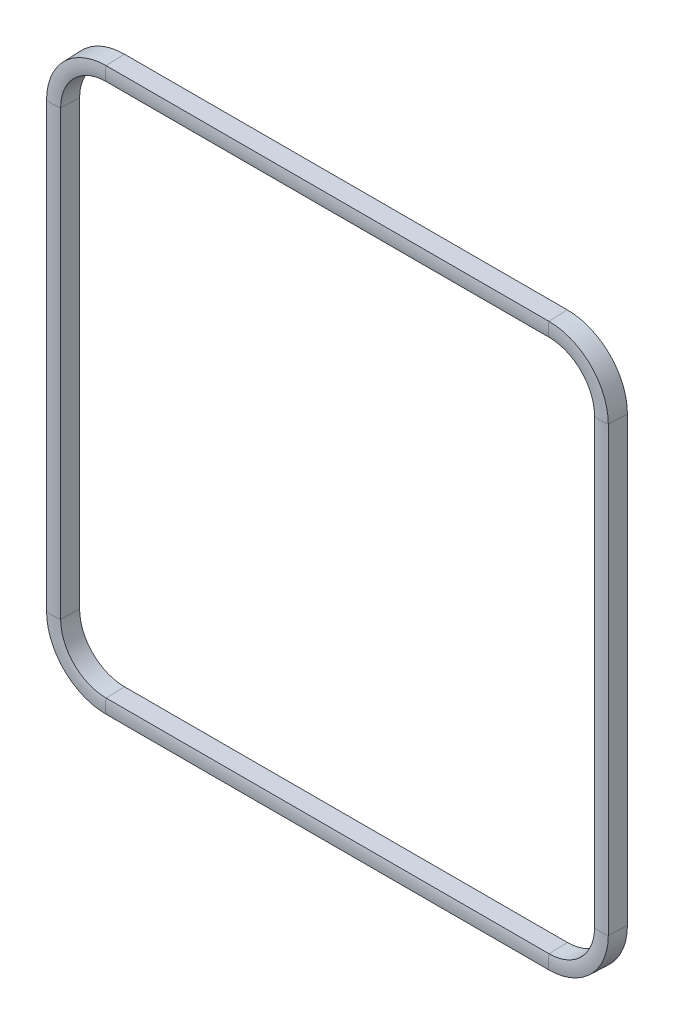
ISO-10303-21;
HEADER;
FILE_DESCRIPTION(('STEP AP214'),'2;1');
FILE_NAME('part.step','',(''),(''),'','','');
FILE_SCHEMA(('AUTOMOTIVE_DESIGN { 1 0 10303 214 1 1 1 1 }'));
ENDSEC;
DATA;
#1=APPLICATION_CONTEXT('core data for automotive mechanical design processes');
#2=APPLICATION_PROTOCOL_DEFINITION('international standard','automotive_design',2000,#1);
#3=PRODUCT_CONTEXT('',#1,'mechanical');
#4=PRODUCT('Part','Part','',(#3));
#5=PRODUCT_RELATED_PRODUCT_CATEGORY('part','',(#4));
#6=PRODUCT_DEFINITION_FORMATION('','',#4);
#7=PRODUCT_DEFINITION_CONTEXT('part definition',#1,'design');
#8=PRODUCT_DEFINITION('design','',#6,#7);
#9=PRODUCT_DEFINITION_SHAPE('','',#8);
#10=(LENGTH_UNIT() NAMED_UNIT(*) SI_UNIT(.MILLI.,.METRE.));
#11=(NAMED_UNIT(*) PLANE_ANGLE_UNIT() SI_UNIT($,.RADIAN.));
#12=(NAMED_UNIT(*) SI_UNIT($,.STERADIAN.) SOLID_ANGLE_UNIT());
#13=UNCERTAINTY_MEASURE_WITH_UNIT(LENGTH_MEASURE(1.E-05),#10,'distance_accuracy_value','');
#14=(GEOMETRIC_REPRESENTATION_CONTEXT(3) GLOBAL_UNCERTAINTY_ASSIGNED_CONTEXT((#13)) GLOBAL_UNIT_ASSIGNED_CONTEXT((#10,
#11,#12)) REPRESENTATION_CONTEXT('',''));
#15=CARTESIAN_POINT('',(0.,0.,0.));
#16=DIRECTION('',(0.,0.,1.));
#17=DIRECTION('',(1.,0.,0.));
#18=AXIS2_PLACEMENT_3D('',#15,#16,#17);
#19=CARTESIAN_POINT('',(1.95906030197852,-66.,32.4003655037885));
#20=CARTESIAN_POINT('',(1.95906030197851,-8.,32.4003655037885));
#21=CARTESIAN_POINT('',(2.76408131139616,-66.,32.5898763520899));
#22=CARTESIAN_POINT('',(2.76408131139614,-8.,32.5898763520899));
#23=CARTESIAN_POINT('',(3.78024547415872,-66.,32.4202454741587));
#24=CARTESIAN_POINT('',(3.78024547415871,-8.,32.4202454741587));
#25=B_SPLINE_SURFACE_WITH_KNOTS('',2,1,((#19,#20),(#21,#22),(#23,#24)),.UNSPECIFIED.,.F.,.F.,
.F.,(3,3),(2,2),(0.,1.),(0.,1.),.UNSPECIFIED.);
#26=DIRECTION('',(0.,1.,0.));
#27=VECTOR('',#26,1.);
#28=CARTESIAN_POINT('',(1.95906030197852,-66.,32.4003655037885));
#29=LINE('',#28,#27);
#30=CARTESIAN_POINT('',(1.95906030197925,-66.,32.4003655037924));
#31=VERTEX_POINT('',#30);
#32=CARTESIAN_POINT('',(1.9590603019782,-8.,32.4003655037963));
#33=VERTEX_POINT('',#32);
#34=EDGE_CURVE('E137',#31,#33,#29,.T.);
#35=CARTESIAN_POINT('',(1.95906030197852,-66.,32.4003655037885));
#36=CARTESIAN_POINT('',(2.76408131139616,-66.,32.5898763520899));
#37=CARTESIAN_POINT('',(3.78024547415872,-66.,32.4202454741587));
#38=B_SPLINE_CURVE_WITH_KNOTS('',2,(#35,#36,#37),.UNSPECIFIED.,.F.,.F.,(3,3),(0.,1.),.UNSPECIFIED.);
#39=CARTESIAN_POINT('',(3.78024547415872,-66.,32.4202454741587));
#40=VERTEX_POINT('',#39);
#41=EDGE_CURVE('E135',#31,#40,#38,.T.);
#42=DIRECTION('',(0.,1.,0.));
#43=VECTOR('',#42,1.);
#44=CARTESIAN_POINT('',(3.78024547415872,-66.,32.4202454741587));
#45=LINE('',#44,#43);
#46=CARTESIAN_POINT('',(3.7802454741587,-8.,32.4202454741587));
#47=VERTEX_POINT('',#46);
#48=EDGE_CURVE('E94',#47,#40,#45,.F.);
#49=CARTESIAN_POINT('',(1.95906030197851,-8.,32.4003655037885));
#50=CARTESIAN_POINT('',(2.76408131139613,-8.,32.5898763520899));
#51=CARTESIAN_POINT('',(3.7802454741587,-8.,32.4202454741587));
#52=B_SPLINE_CURVE_WITH_KNOTS('',2,(#49,#50,#51),.UNSPECIFIED.,.F.,.F.,(3,3),(0.,1.),.UNSPECIFIED.);
#53=EDGE_CURVE('E218',#47,#33,#52,.F.);
#54=ORIENTED_EDGE('',*,*,#34,.F.);
#55=ORIENTED_EDGE('',*,*,#41,.T.);
#56=ORIENTED_EDGE('',*,*,#48,.F.);
#57=ORIENTED_EDGE('',*,*,#53,.T.);
#58=EDGE_LOOP('',(#54,#55,#56,#57));
#59=FACE_BOUND('',#58,.T.);
#60=ADVANCED_FACE('F15',(#59),#25,.T.);
#61=CARTESIAN_POINT('',(1.95906030197852,-66.,32.4003655037885));
#62=CARTESIAN_POINT('',(1.95906030197852,-69.4907367058999,32.4003655037885));
#63=CARTESIAN_POINT('',(-0.509263294100096,-71.9590603019785,32.4003655037885));
#64=CARTESIAN_POINT('',(-3.99999999999999,-71.9590603019785,32.4003655037885));
#65=CARTESIAN_POINT('',(2.76408131139616,-66.,32.5898763520899));
#66=CARTESIAN_POINT('',(2.76408131139616,-69.9623070952215,32.5898763520899));
#67=CARTESIAN_POINT('',(-0.0376929047785236,-72.7640813113961,32.5898763520899));
#68=CARTESIAN_POINT('',(-3.99999999999999,-72.7640813113961,32.5898763520899));
#69=CARTESIAN_POINT('',(3.78024547415872,-66.,32.4202454741587));
#70=CARTESIAN_POINT('',(3.78024547415872,-70.5575622801703,32.4202454741587));
#71=CARTESIAN_POINT('',(0.557562280170287,-73.7802454741587,32.4202454741587));
#72=CARTESIAN_POINT('',(-3.99999999999999,-73.7802454741587,32.4202454741587));
#73=(BOUNDED_SURFACE() B_SPLINE_SURFACE(2,3,((#61,#62,#63,#64),(#65,#66,#67,#68),(#69,#70,#71,
#72)),.UNSPECIFIED.,.F.,.F.,.F.) B_SPLINE_SURFACE_WITH_KNOTS((3,3),(4,4),(0.,1.),(0.,1.),
.UNSPECIFIED.) GEOMETRIC_REPRESENTATION_ITEM() RATIONAL_B_SPLINE_SURFACE(((1.,0.804737854124365,
0.804737854124365,1.),(1.,0.804737854124365,0.804737854124365,1.),(1.,0.804737854124365,
0.804737854124365,1.))) REPRESENTATION_ITEM('') SURFACE());
#74=CARTESIAN_POINT('',(-3.99999999999999,-66.,32.4003655038041));
#75=DIRECTION('',(0.,0.,1.));
#76=DIRECTION('',(1.,0.,0.));
#77=AXIS2_PLACEMENT_3D('',#74,#75,#76);
#78=CIRCLE('',#77,5.95906030198144);
#79=CARTESIAN_POINT('',(-3.99999999999999,-71.9590603019792,32.4003655037924));
#80=VERTEX_POINT('',#79);
#81=EDGE_CURVE('E230',#31,#80,#78,.F.);
#82=CARTESIAN_POINT('',(-3.99999999999999,-71.9590603019785,32.4003655037885));
#83=CARTESIAN_POINT('',(-3.99999999999999,-72.7640813113961,32.5898763520899));
#84=CARTESIAN_POINT('',(-3.99999999999999,-73.7802454741587,32.4202454741587));
#85=B_SPLINE_CURVE_WITH_KNOTS('',2,(#82,#83,#84),.UNSPECIFIED.,.F.,.F.,(3,3),(0.,1.),.UNSPECIFIED.);
#86=CARTESIAN_POINT('',(-3.99999999999999,-73.7802454741587,32.4202454741587));
#87=VERTEX_POINT('',#86);
#88=EDGE_CURVE('E141',#80,#87,#85,.T.);
#89=CARTESIAN_POINT('',(-3.99999999999999,-66.,32.4202454741587));
#90=DIRECTION('',(0.,0.,-1.));
#91=DIRECTION('',(-1.,0.,0.));
#92=AXIS2_PLACEMENT_3D('',#89,#90,#91);
#93=CIRCLE('',#92,7.78024547415871);
#94=EDGE_CURVE('E155',#40,#87,#93,.T.);
#95=ORIENTED_EDGE('',*,*,#81,.T.);
#96=ORIENTED_EDGE('',*,*,#88,.T.);
#97=ORIENTED_EDGE('',*,*,#94,.F.);
#98=ORIENTED_EDGE('',*,*,#41,.F.);
#99=EDGE_LOOP('',(#95,#96,#97,#98));
#100=FACE_BOUND('',#99,.T.);
#101=ADVANCED_FACE('F156',(#100),#73,.F.);
#102=CARTESIAN_POINT('',(-3.99999999999999,-71.9590603019785,32.4003655037885));
#103=CARTESIAN_POINT('',(-62.,-71.9590603019785,32.4003655037885));
#104=CARTESIAN_POINT('',(-3.99999999999999,-72.7640813113961,32.5898763520899));
#105=CARTESIAN_POINT('',(-62.,-72.7640813113961,32.5898763520899));
#106=CARTESIAN_POINT('',(-3.99999999999999,-73.7802454741587,32.4202454741587));
#107=CARTESIAN_POINT('',(-62.,-73.7802454741587,32.4202454741587));
#108=B_SPLINE_SURFACE_WITH_KNOTS('',2,1,((#102,#103),(#104,#105),(#106,#107)),.UNSPECIFIED.,.F.,
.F.,.F.,(3,3),(2,2),(0.,1.),(0.,1.),.UNSPECIFIED.);
#109=DIRECTION('',(1.,0.,0.));
#110=VECTOR('',#109,1.);
#111=CARTESIAN_POINT('',(-3.99999999999999,-71.9590603019785,32.4003655037885));
#112=LINE('',#111,#110);
#113=CARTESIAN_POINT('',(-62.,-71.9590603019793,32.4003655037924));
#114=VERTEX_POINT('',#113);
#115=EDGE_CURVE('E176',#80,#114,#112,.F.);
#116=CARTESIAN_POINT('',(-62.,-71.9590603019785,32.4003655037885));
#117=CARTESIAN_POINT('',(-62.,-72.7640813113961,32.5898763520899));
#118=CARTESIAN_POINT('',(-62.,-73.7802454741587,32.4202454741587));
#119=B_SPLINE_CURVE_WITH_KNOTS('',2,(#116,#117,#118),.UNSPECIFIED.,.F.,.F.,(3,3),(0.,1.),.UNSPECIFIED.);
#120=CARTESIAN_POINT('',(-62.,-73.7802454741587,32.4202454741587));
#121=VERTEX_POINT('',#120);
#122=EDGE_CURVE('E281',#114,#121,#119,.T.);
#123=DIRECTION('',(1.,0.,0.));
#124=VECTOR('',#123,1.);
#125=CARTESIAN_POINT('',(-3.99999999999999,-73.7802454741587,32.4202454741587));
#126=LINE('',#125,#124);
#127=EDGE_CURVE('E161',#121,#87,#126,.T.);
#128=ORIENTED_EDGE('',*,*,#115,.T.);
#129=ORIENTED_EDGE('',*,*,#122,.T.);
#130=ORIENTED_EDGE('',*,*,#127,.T.);
#131=ORIENTED_EDGE('',*,*,#88,.F.);
#132=EDGE_LOOP('',(#128,#129,#130,#131));
#133=FACE_BOUND('',#132,.T.);
#134=ADVANCED_FACE('F454',(#133),#108,.F.);
#135=CARTESIAN_POINT('',(-62.,-71.9590603019785,32.4003655037885));
#136=CARTESIAN_POINT('',(-65.4907367058999,-71.9590603019785,32.4003655037885));
#137=CARTESIAN_POINT('',(-67.9590603019785,-69.4907367058999,32.4003655037885));
#138=CARTESIAN_POINT('',(-67.9590603019785,-66.,32.4003655037885));
#139=CARTESIAN_POINT('',(-62.,-72.7640813113961,32.5898763520899));
#140=CARTESIAN_POINT('',(-65.9623070952214,-72.7640813113961,32.5898763520899));
#141=CARTESIAN_POINT('',(-68.7640813113961,-69.9623070952215,32.5898763520899));
#142=CARTESIAN_POINT('',(-68.7640813113961,-66.,32.5898763520899));
#143=CARTESIAN_POINT('',(-62.,-73.7802454741587,32.4202454741587));
#144=CARTESIAN_POINT('',(-66.5575622801703,-73.7802454741587,32.4202454741587));
#145=CARTESIAN_POINT('',(-69.7802454741587,-70.5575622801703,32.4202454741587));
#146=CARTESIAN_POINT('',(-69.7802454741587,-66.,32.4202454741587));
#147=(BOUNDED_SURFACE() B_SPLINE_SURFACE(2,3,((#135,#136,#137,#138),(#139,#140,#141,#142),(#143,
#144,#145,#146)),.UNSPECIFIED.,.F.,.F.,.F.) B_SPLINE_SURFACE_WITH_KNOTS((3,3),(4,4),(0.,1.),(0.,
1.),.UNSPECIFIED.) GEOMETRIC_REPRESENTATION_ITEM() RATIONAL_B_SPLINE_SURFACE(((1.,
0.804737854124365,0.804737854124365,1.),(1.,0.804737854124365,0.804737854124365,1.),(1.,
0.804737854124365,0.804737854124365,1.))) REPRESENTATION_ITEM('') SURFACE());
#148=CARTESIAN_POINT('',(-62.,-66.,32.4003655038041));
#149=DIRECTION('',(0.,0.,1.));
#150=DIRECTION('',(1.,0.,0.));
#151=AXIS2_PLACEMENT_3D('',#148,#149,#150);
#152=CIRCLE('',#151,5.95906030198161);
#153=CARTESIAN_POINT('',(-67.9590603019789,-66.,32.4003655037679));
#154=VERTEX_POINT('',#153);
#155=EDGE_CURVE('E184',#114,#154,#152,.F.);
#156=CARTESIAN_POINT('',(-67.9590603019785,-66.,32.4003655037885));
#157=CARTESIAN_POINT('',(-68.7640813113961,-66.,32.5898763520899));
#158=CARTESIAN_POINT('',(-69.7802454741587,-66.,32.4202454741587));
#159=B_SPLINE_CURVE_WITH_KNOTS('',2,(#156,#157,#158),.UNSPECIFIED.,.F.,.F.,(3,3),(0.,1.),.UNSPECIFIED.);
#160=CARTESIAN_POINT('',(-69.7802454741587,-66.,32.4202454741587));
#161=VERTEX_POINT('',#160);
#162=EDGE_CURVE('E260',#154,#161,#159,.T.);
#163=CARTESIAN_POINT('',(-62.,-66.,32.4202454741587));
#164=DIRECTION('',(0.,0.,-1.));
#165=DIRECTION('',(-1.,0.,0.));
#166=AXIS2_PLACEMENT_3D('',#163,#164,#165);
#167=CIRCLE('',#166,7.7802454741587);
#168=EDGE_CURVE('E272',#121,#161,#167,.T.);
#169=ORIENTED_EDGE('',*,*,#155,.T.);
#170=ORIENTED_EDGE('',*,*,#162,.T.);
#171=ORIENTED_EDGE('',*,*,#168,.F.);
#172=ORIENTED_EDGE('',*,*,#122,.F.);
#173=EDGE_LOOP('',(#169,#170,#171,#172));
#174=FACE_BOUND('',#173,.T.);
#175=ADVANCED_FACE('F452',(#174),#147,.F.);
#176=CARTESIAN_POINT('',(-67.9590603019785,-66.,32.4003655037885));
#177=CARTESIAN_POINT('',(-67.9590603019785,-8.00000000000003,32.4003655037885));
#178=CARTESIAN_POINT('',(-68.7640813113961,-66.,32.5898763520899));
#179=CARTESIAN_POINT('',(-68.7640813113961,-8.00000000000003,32.5898763520899));
#180=CARTESIAN_POINT('',(-69.7802454741587,-66.,32.4202454741587));
#181=CARTESIAN_POINT('',(-69.7802454741587,-8.00000000000003,32.4202454741587));
#182=B_SPLINE_SURFACE_WITH_KNOTS('',2,1,((#176,#177),(#178,#179),(#180,#181)),.UNSPECIFIED.,.F.,
.F.,.F.,(3,3),(2,2),(0.,1.),(0.,1.),.UNSPECIFIED.);
#183=DIRECTION('',(0.,1.,0.));
#184=VECTOR('',#183,1.);
#185=CARTESIAN_POINT('',(-67.9590603019785,-66.,32.4003655037885));
#186=LINE('',#185,#184);
#187=CARTESIAN_POINT('',(-67.9590603019784,-8.,32.4003655037924));
#188=VERTEX_POINT('',#187);
#189=EDGE_CURVE('E189',#154,#188,#186,.T.);
#190=CARTESIAN_POINT('',(-67.9590603019785,-8.,32.4003655037885));
#191=CARTESIAN_POINT('',(-68.7640813113961,-8.,32.5898763520899));
#192=CARTESIAN_POINT('',(-69.7802454741587,-8.,32.4202454741587));
#193=B_SPLINE_CURVE_WITH_KNOTS('',2,(#190,#191,#192),.UNSPECIFIED.,.F.,.F.,(3,3),(0.,1.),.UNSPECIFIED.);
#194=CARTESIAN_POINT('',(-69.7802454741587,-8.,32.4202454741587));
#195=VERTEX_POINT('',#194);
#196=EDGE_CURVE('E251',#188,#195,#193,.T.);
#197=DIRECTION('',(0.,1.,0.));
#198=VECTOR('',#197,1.);
#199=CARTESIAN_POINT('',(-69.7802454741587,-66.,32.4202454741587));
#200=LINE('',#199,#198);
#201=EDGE_CURVE('E265',#195,#161,#200,.F.);
#202=ORIENTED_EDGE('',*,*,#189,.T.);
#203=ORIENTED_EDGE('',*,*,#196,.T.);
#204=ORIENTED_EDGE('',*,*,#201,.T.);
#205=ORIENTED_EDGE('',*,*,#162,.F.);
#206=EDGE_LOOP('',(#202,#203,#204,#205));
#207=FACE_BOUND('',#206,.T.);
#208=ADVANCED_FACE('F449',(#207),#182,.F.);
#209=CARTESIAN_POINT('',(-67.9590603019785,-8.,32.4003655037885));
#210=CARTESIAN_POINT('',(-67.9590603019785,-4.50926329410011,32.4003655037885));
#211=CARTESIAN_POINT('',(-65.4907367058999,-2.04093969802149,32.4003655037885));
#212=CARTESIAN_POINT('',(-62.,-2.04093969802149,32.4003655037885));
#213=CARTESIAN_POINT('',(-68.7640813113961,-8.,32.5898763520899));
#214=CARTESIAN_POINT('',(-68.7640813113961,-4.03769290477854,32.5898763520899));
#215=CARTESIAN_POINT('',(-65.9623070952214,-1.23591868860387,32.5898763520899));
#216=CARTESIAN_POINT('',(-62.,-1.23591868860387,32.5898763520899));
#217=CARTESIAN_POINT('',(-69.7802454741587,-8.,32.4202454741587));
#218=CARTESIAN_POINT('',(-69.7802454741587,-3.44243771982973,32.4202454741587));
#219=CARTESIAN_POINT('',(-66.5575622801703,-0.219754525841304,32.4202454741587));
#220=CARTESIAN_POINT('',(-62.,-0.219754525841304,32.4202454741587));
#221=(BOUNDED_SURFACE() B_SPLINE_SURFACE(2,3,((#209,#210,#211,#212),(#213,#214,#215,#216),(#217,
#218,#219,#220)),.UNSPECIFIED.,.F.,.F.,.F.) B_SPLINE_SURFACE_WITH_KNOTS((3,3),(4,4),(0.,1.),(0.,
1.),.UNSPECIFIED.) GEOMETRIC_REPRESENTATION_ITEM() RATIONAL_B_SPLINE_SURFACE(((1.,
0.804737854124365,0.804737854124365,1.),(1.,0.804737854124365,0.804737854124365,1.),(1.,
0.804737854124365,0.804737854124365,1.))) REPRESENTATION_ITEM('') SURFACE());
#222=CARTESIAN_POINT('',(-62.,-8.,32.4003655038041));
#223=DIRECTION('',(0.,0.,1.));
#224=DIRECTION('',(1.,0.,0.));
#225=AXIS2_PLACEMENT_3D('',#222,#223,#224);
#226=CIRCLE('',#225,5.95906030197806);
#227=CARTESIAN_POINT('',(-62.,-2.0409396980221,32.4003655037963));
#228=VERTEX_POINT('',#227);
#229=EDGE_CURVE('E194',#188,#228,#226,.F.);
#230=CARTESIAN_POINT('',(-62.,-2.04093969802149,32.4003655037885));
#231=CARTESIAN_POINT('',(-62.,-1.23591868860387,32.5898763520899));
#232=CARTESIAN_POINT('',(-62.,-0.219754525841304,32.4202454741587));
#233=B_SPLINE_CURVE_WITH_KNOTS('',2,(#230,#231,#232),.UNSPECIFIED.,.F.,.F.,(3,3),(0.,1.),.UNSPECIFIED.);
#234=CARTESIAN_POINT('',(-62.,-0.219754525841306,32.4202454741587));
#235=VERTEX_POINT('',#234);
#236=EDGE_CURVE('E221',#228,#235,#233,.T.);
#237=CARTESIAN_POINT('',(-62.,-8.,32.4202454741587));
#238=DIRECTION('',(0.,0.,-1.));
#239=DIRECTION('',(-1.,0.,0.));
#240=AXIS2_PLACEMENT_3D('',#237,#238,#239);
#241=CIRCLE('',#240,7.78024547415869);
#242=EDGE_CURVE('E242',#195,#235,#241,.T.);
#243=ORIENTED_EDGE('',*,*,#229,.T.);
#244=ORIENTED_EDGE('',*,*,#236,.T.);
#245=ORIENTED_EDGE('',*,*,#242,.F.);
#246=ORIENTED_EDGE('',*,*,#196,.F.);
#247=EDGE_LOOP('',(#243,#244,#245,#246));
#248=FACE_BOUND('',#247,.T.);
#249=ADVANCED_FACE('F445',(#248),#221,.F.);
#250=CARTESIAN_POINT('',(-62.,-2.04093969802149,32.4003655037885));
#251=CARTESIAN_POINT('',(-4.,-2.04093969802149,32.4003655037885));
#252=CARTESIAN_POINT('',(-62.,-1.23591868860387,32.5898763520899));
#253=CARTESIAN_POINT('',(-4.,-1.23591868860387,32.5898763520899));
#254=CARTESIAN_POINT('',(-62.,-0.219754525841304,32.4202454741587));
#255=CARTESIAN_POINT('',(-4.,-0.219754525841304,32.4202454741587));
#256=B_SPLINE_SURFACE_WITH_KNOTS('',2,1,((#250,#251),(#252,#253),(#254,#255)),.UNSPECIFIED.,.F.,
.F.,.F.,(3,3),(2,2),(0.,1.),(0.,1.),.UNSPECIFIED.);
#257=DIRECTION('',(1.,0.,0.));
#258=VECTOR('',#257,1.);
#259=CARTESIAN_POINT('',(-62.,-2.04093969802151,32.4003655037885));
#260=LINE('',#259,#258);
#261=CARTESIAN_POINT('',(-4.,-2.04093969802165,32.4003655037924));
#262=VERTEX_POINT('',#261);
#263=EDGE_CURVE('E199',#228,#262,#260,.T.);
#264=CARTESIAN_POINT('',(-4.,-2.04093969802149,32.4003655037885));
#265=CARTESIAN_POINT('',(-4.,-1.23591868860387,32.5898763520899));
#266=CARTESIAN_POINT('',(-4.,-0.219754525841304,32.4202454741587));
#267=B_SPLINE_CURVE_WITH_KNOTS('',2,(#264,#265,#266),.UNSPECIFIED.,.F.,.F.,(3,3),(0.,1.),.UNSPECIFIED.);
#268=CARTESIAN_POINT('',(-4.,-0.219754525841302,32.4202454741587));
#269=VERTEX_POINT('',#268);
#270=EDGE_CURVE('E220',#262,#269,#267,.T.);
#271=DIRECTION('',(1.,0.,0.));
#272=VECTOR('',#271,1.);
#273=CARTESIAN_POINT('',(-62.,-0.219754525841304,32.4202454741587));
#274=LINE('',#273,#272);
#275=EDGE_CURVE('E235',#269,#235,#274,.F.);
#276=ORIENTED_EDGE('',*,*,#263,.T.);
#277=ORIENTED_EDGE('',*,*,#270,.T.);
#278=ORIENTED_EDGE('',*,*,#275,.T.);
#279=ORIENTED_EDGE('',*,*,#236,.F.);
#280=EDGE_LOOP('',(#276,#277,#278,#279));
#281=FACE_BOUND('',#280,.T.);
#282=ADVANCED_FACE('F17',(#281),#256,.F.);
#283=CARTESIAN_POINT('',(-4.,-2.04093969802149,32.4003655037885));
#284=CARTESIAN_POINT('',(-0.509263294100105,-2.04093969802149,32.4003655037885));
#285=CARTESIAN_POINT('',(1.9590603019785,-4.5092632941001,32.4003655037885));
#286=CARTESIAN_POINT('',(1.95906030197851,-8.,32.4003655037885));
#287=CARTESIAN_POINT('',(-4.,-1.23591868860387,32.5898763520899));
#288=CARTESIAN_POINT('',(-0.0376929047785409,-1.23591868860387,32.5898763520899));
#289=CARTESIAN_POINT('',(2.76408131139613,-4.03769290477853,32.5898763520899));
#290=CARTESIAN_POINT('',(2.76408131139613,-8.,32.5898763520899));
#291=CARTESIAN_POINT('',(-4.,-0.219754525841304,32.4202454741587));
#292=CARTESIAN_POINT('',(0.55756228017027,-0.219754525841303,32.4202454741587));
#293=CARTESIAN_POINT('',(3.78024547415869,-3.44243771982972,32.4202454741587));
#294=CARTESIAN_POINT('',(3.7802454741587,-8.,32.4202454741587));
#295=(BOUNDED_SURFACE() B_SPLINE_SURFACE(2,3,((#283,#284,#285,#286),(#287,#288,#289,#290),(#291,
#292,#293,#294)),.UNSPECIFIED.,.F.,.F.,.F.) B_SPLINE_SURFACE_WITH_KNOTS((3,3),(4,4),(0.,1.),(0.,
1.),.UNSPECIFIED.) GEOMETRIC_REPRESENTATION_ITEM() RATIONAL_B_SPLINE_SURFACE(((1.,
0.804737854124365,0.804737854124365,1.),(1.,0.804737854124365,0.804737854124365,1.),(1.,
0.804737854124365,0.804737854124365,1.))) REPRESENTATION_ITEM('') SURFACE());
#296=CARTESIAN_POINT('',(-4.,-8.,32.4003655038041));
#297=DIRECTION('',(0.,0.,1.));
#298=DIRECTION('',(1.,0.,0.));
#299=AXIS2_PLACEMENT_3D('',#296,#297,#298);
#300=CIRCLE('',#299,5.9590603019779);
#301=EDGE_CURVE('E204',#262,#33,#300,.F.);
#302=CARTESIAN_POINT('',(-4.,-8.,32.4202454741587));
#303=DIRECTION('',(0.,0.,-1.));
#304=DIRECTION('',(-1.,0.,0.));
#305=AXIS2_PLACEMENT_3D('',#302,#303,#304);
#306=CIRCLE('',#305,7.7802454741587);
#307=EDGE_CURVE('E214',#269,#47,#306,.T.);
#308=ORIENTED_EDGE('',*,*,#301,.T.);
#309=ORIENTED_EDGE('',*,*,#53,.F.);
#310=ORIENTED_EDGE('',*,*,#307,.F.);
#311=ORIENTED_EDGE('',*,*,#270,.F.);
#312=EDGE_LOOP('',(#308,#309,#310,#311));
#313=FACE_BOUND('',#312,.T.);
#314=ADVANCED_FACE('F513',(#313),#295,.F.);
#315=CARTESIAN_POINT('',(-3.99999999999999,-66.,32.4003655036904));
#316=DIRECTION('',(0.,0.,1.));
#317=DIRECTION('',(1.,0.,0.));
#318=AXIS2_PLACEMENT_3D('',#315,#316,#317);
#319=CONICAL_SURFACE('',#318,5.95906030197789,0.0349065850394824);
#320=CARTESIAN_POINT('',(-3.99999999999999,-66.,29.9999999999727));
#321=DIRECTION('',(0.,0.,1.));
#322=DIRECTION('',(1.,0.,0.));
#323=AXIS2_PLACEMENT_3D('',#320,#321,#322);
#324=CIRCLE('',#323,5.87523769152759);
#325=CARTESIAN_POINT('',(-3.99999999999999,-71.8752376915243,29.9999999999864));
#326=VERTEX_POINT('',#325);
#327=CARTESIAN_POINT('',(1.8752376915243,-66.,29.9999999999864));
#328=VERTEX_POINT('',#327);
#329=EDGE_CURVE('E21',#326,#328,#324,.T.);
#330=ORIENTED_EDGE('',*,*,#329,.F.);
#331=DIRECTION('',(0.,0.034899496702501,-0.999390827019096));
#332=VECTOR('',#331,1.);
#333=CARTESIAN_POINT('',(-3.99999999999999,-71.8752376915248,30.));
#334=LINE('',#333,#332);
#335=EDGE_CURVE('E152',#326,#80,#334,.F.);
#336=ORIENTED_EDGE('',*,*,#335,.T.);
#337=ORIENTED_EDGE('',*,*,#81,.F.);
#338=DIRECTION('',(0.034899496702501,0.,0.999390827019096));
#339=VECTOR('',#338,1.);
#340=CARTESIAN_POINT('',(1.87523769152478,-66.,30.));
#341=LINE('',#340,#339);
#342=EDGE_CURVE('E207',#328,#31,#341,.T.);
#343=ORIENTED_EDGE('',*,*,#342,.F.);
#344=EDGE_LOOP('',(#330,#336,#337,#343));
#345=FACE_BOUND('',#344,.T.);
#346=ADVANCED_FACE('F428',(#345),#319,.F.);
#347=CARTESIAN_POINT('',(1.87523769152478,-66.,30.));
#348=DIRECTION('',(-0.999390827019096,0.,0.034899496702501));
#349=DIRECTION('',(0.034899496702501,0.,0.999390827019096));
#350=AXIS2_PLACEMENT_3D('',#347,#348,#349);
#351=PLANE('',#350);
#352=DIRECTION('',(0.,1.,0.));
#353=VECTOR('',#352,1.);
#354=CARTESIAN_POINT('',(1.87523769152478,-66.,30.));
#355=LINE('',#354,#353);
#356=CARTESIAN_POINT('',(1.875237691524,-8.,29.9999999999795));
#357=VERTEX_POINT('',#356);
#358=EDGE_CURVE('E368',#328,#357,#355,.T.);
#359=ORIENTED_EDGE('',*,*,#358,.F.);
#360=ORIENTED_EDGE('',*,*,#342,.T.);
#361=ORIENTED_EDGE('',*,*,#34,.T.);
#362=DIRECTION('',(-0.0348994967025061,0.,-0.999390827019096));
#363=VECTOR('',#362,1.);
#364=CARTESIAN_POINT('',(17426.2915909915,-8.,499000.));
#365=LINE('',#364,#363);
#366=EDGE_CURVE('E202',#33,#357,#365,.T.);
#367=ORIENTED_EDGE('',*,*,#366,.T.);
#368=EDGE_LOOP('',(#359,#360,#361,#367));
#369=FACE_BOUND('',#368,.T.);
#370=ADVANCED_FACE('F430',(#369),#351,.T.);
#371=CARTESIAN_POINT('',(-4.,-8.,32.4003655038041));
#372=DIRECTION('',(0.,0.,1.));
#373=DIRECTION('',(1.,0.,0.));
#374=AXIS2_PLACEMENT_3D('',#371,#372,#373);
#375=CONICAL_SURFACE('',#374,5.9590603019779,0.0349065850403084);
#376=CARTESIAN_POINT('',(-4.,-8.,29.9999999999727));
#377=DIRECTION('',(0.,0.,1.));
#378=DIRECTION('',(1.,0.,0.));
#379=AXIS2_PLACEMENT_3D('',#376,#377,#378);
#380=CIRCLE('',#379,5.87523769152165);
#381=CARTESIAN_POINT('',(-4.,-2.12476230847572,29.9999999999864));
#382=VERTEX_POINT('',#381);
#383=EDGE_CURVE('E366',#357,#382,#380,.T.);
#384=ORIENTED_EDGE('',*,*,#383,.F.);
#385=ORIENTED_EDGE('',*,*,#366,.F.);
#386=ORIENTED_EDGE('',*,*,#301,.F.);
#387=DIRECTION('',(0.,0.034899496702501,0.999390827019096));
#388=VECTOR('',#387,1.);
#389=CARTESIAN_POINT('',(-4.,-2.12476230847525,30.));
#390=LINE('',#389,#388);
#391=EDGE_CURVE('E197',#262,#382,#390,.F.);
#392=ORIENTED_EDGE('',*,*,#391,.T.);
#393=EDGE_LOOP('',(#384,#385,#386,#392));
#394=FACE_BOUND('',#393,.T.);
#395=ADVANCED_FACE('F434',(#394),#375,.F.);
#396=CARTESIAN_POINT('',(-62.,-2.12476230847525,30.));
#397=DIRECTION('',(0.,0.999390827019096,-0.034899496702501));
#398=DIRECTION('',(0.,0.034899496702501,0.999390827019096));
#399=AXIS2_PLACEMENT_3D('',#396,#397,#398);
#400=PLANE('',#399);
#401=DIRECTION('',(-1.,0.,0.));
#402=VECTOR('',#401,1.);
#403=CARTESIAN_POINT('',(3.86476230847526,-2.12476230847525,30.));
#404=LINE('',#403,#402);
#405=CARTESIAN_POINT('',(-62.,-2.12476230847902,29.9999999999795));
#406=VERTEX_POINT('',#405);
#407=EDGE_CURVE('E365',#382,#406,#404,.T.);
#408=ORIENTED_EDGE('',*,*,#407,.F.);
#409=ORIENTED_EDGE('',*,*,#391,.F.);
#410=ORIENTED_EDGE('',*,*,#263,.F.);
#411=DIRECTION('',(0.,-0.0348994967025061,-0.999390827019096));
#412=VECTOR('',#411,1.);
#413=CARTESIAN_POINT('',(-61.9999999999989,17422.2915909915,499000.));
#414=LINE('',#413,#412);
#415=EDGE_CURVE('E192',#228,#406,#414,.T.);
#416=ORIENTED_EDGE('',*,*,#415,.T.);
#417=EDGE_LOOP('',(#408,#409,#410,#416));
#418=FACE_BOUND('',#417,.T.);
#419=ADVANCED_FACE('F439',(#418),#400,.F.);
#420=CARTESIAN_POINT('',(-62.,-8.,32.4003655038041));
#421=DIRECTION('',(0.,0.,1.));
#422=DIRECTION('',(1.,0.,0.));
#423=AXIS2_PLACEMENT_3D('',#420,#421,#422);
#424=CONICAL_SURFACE('',#423,5.95906030197806,0.0349065850403084);
#425=CARTESIAN_POINT('',(-62.,-8.,29.9999999999727));
#426=DIRECTION('',(0.,0.,1.));
#427=DIRECTION('',(1.,0.,0.));
#428=AXIS2_PLACEMENT_3D('',#425,#426,#427);
#429=CIRCLE('',#428,5.8752376915218);
#430=CARTESIAN_POINT('',(-67.8752376915243,-8.,29.9999999999864));
#431=VERTEX_POINT('',#430);
#432=EDGE_CURVE('E363',#406,#431,#429,.T.);
#433=ORIENTED_EDGE('',*,*,#432,.F.);
#434=ORIENTED_EDGE('',*,*,#415,.F.);
#435=ORIENTED_EDGE('',*,*,#229,.F.);
#436=DIRECTION('',(-0.034899496702501,0.,0.999390827019096));
#437=VECTOR('',#436,1.);
#438=CARTESIAN_POINT('',(-67.8752376915247,-8.,30.));
#439=LINE('',#438,#437);
#440=EDGE_CURVE('E187',#188,#431,#439,.F.);
#441=ORIENTED_EDGE('',*,*,#440,.T.);
#442=EDGE_LOOP('',(#433,#434,#435,#441));
#443=FACE_BOUND('',#442,.T.);
#444=ADVANCED_FACE('F443',(#443),#424,.F.);
#445=CARTESIAN_POINT('',(-67.8752376915247,-66.,30.));
#446=DIRECTION('',(-0.999390827019096,0.,-0.034899496702501));
#447=DIRECTION('',(-0.034899496702501,0.,0.999390827019096));
#448=AXIS2_PLACEMENT_3D('',#445,#446,#447);
#449=PLANE('',#448);
#450=DIRECTION('',(0.,1.,0.));
#451=VECTOR('',#450,1.);
#452=CARTESIAN_POINT('',(-67.8752376915247,-66.,30.));
#453=LINE('',#452,#451);
#454=CARTESIAN_POINT('',(-67.8752376915237,-66.,29.9999999999795));
#455=VERTEX_POINT('',#454);
#456=EDGE_CURVE('E362',#431,#455,#453,.F.);
#457=ORIENTED_EDGE('',*,*,#456,.F.);
#458=ORIENTED_EDGE('',*,*,#440,.F.);
#459=ORIENTED_EDGE('',*,*,#189,.F.);
#460=DIRECTION('',(0.0348994967025003,0.,-0.999390827019096));
#461=VECTOR('',#460,1.);
#462=CARTESIAN_POINT('',(-17492.2915909886,-65.9999999999979,499000.));
#463=LINE('',#462,#461);
#464=EDGE_CURVE('E182',#154,#455,#463,.T.);
#465=ORIENTED_EDGE('',*,*,#464,.T.);
#466=EDGE_LOOP('',(#457,#458,#459,#465));
#467=FACE_BOUND('',#466,.T.);
#468=ADVANCED_FACE('F417',(#467),#449,.F.);
#469=CARTESIAN_POINT('',(-62.,-66.,32.4003655036904));
#470=DIRECTION('',(0.,0.,1.));
#471=DIRECTION('',(1.,0.,0.));
#472=AXIS2_PLACEMENT_3D('',#469,#470,#471);
#473=CONICAL_SURFACE('',#472,5.95906030197806,0.0349065850403084);
#474=CARTESIAN_POINT('',(-62.,-66.,29.9999999999727));
#475=DIRECTION('',(0.,0.,1.));
#476=DIRECTION('',(1.,0.,0.));
#477=AXIS2_PLACEMENT_3D('',#474,#475,#476);
#478=CIRCLE('',#477,5.87523769152577);
#479=CARTESIAN_POINT('',(-62.,-71.8752376915243,29.9999999999864));
#480=VERTEX_POINT('',#479);
#481=EDGE_CURVE('E358',#455,#480,#478,.T.);
#482=ORIENTED_EDGE('',*,*,#481,.F.);
#483=ORIENTED_EDGE('',*,*,#464,.F.);
#484=ORIENTED_EDGE('',*,*,#155,.F.);
#485=DIRECTION('',(0.,0.034899496702501,-0.999390827019096));
#486=VECTOR('',#485,1.);
#487=CARTESIAN_POINT('',(-62.,-71.8752376915248,30.));
#488=LINE('',#487,#486);
#489=EDGE_CURVE('E174',#114,#480,#488,.T.);
#490=ORIENTED_EDGE('',*,*,#489,.T.);
#491=EDGE_LOOP('',(#482,#483,#484,#490));
#492=FACE_BOUND('',#491,.T.);
#493=ADVANCED_FACE('F422',(#492),#473,.F.);
#494=CARTESIAN_POINT('',(-3.99999999999999,-71.8752376915248,30.));
#495=DIRECTION('',(0.,-0.999390827019096,-0.034899496702501));
#496=DIRECTION('',(0.,0.034899496702501,-0.999390827019096));
#497=AXIS2_PLACEMENT_3D('',#494,#495,#496);
#498=PLANE('',#497);
#499=DIRECTION('',(-1.,0.,0.));
#500=VECTOR('',#499,1.);
#501=CARTESIAN_POINT('',(3.86476230847526,-71.8752376915248,30.));
#502=LINE('',#501,#500);
#503=EDGE_CURVE('E361',#480,#326,#502,.F.);
#504=ORIENTED_EDGE('',*,*,#503,.F.);
#505=ORIENTED_EDGE('',*,*,#489,.F.);
#506=ORIENTED_EDGE('',*,*,#115,.F.);
#507=ORIENTED_EDGE('',*,*,#335,.F.);
#508=EDGE_LOOP('',(#504,#505,#506,#507));
#509=FACE_BOUND('',#508,.T.);
#510=ADVANCED_FACE('F427',(#509),#498,.F.);
#511=CARTESIAN_POINT('',(3.78024547415872,-66.,32.4202454741587));
#512=DIRECTION('',(0.999390827019096,0.,0.0348994967025009));
#513=DIRECTION('',(0.0348994967025009,0.,-0.999390827019096));
#514=AXIS2_PLACEMENT_3D('',#511,#512,#513);
#515=PLANE('',#514);
#516=ORIENTED_EDGE('',*,*,#48,.T.);
#517=DIRECTION('',(-0.0348994967025006,0.,0.999390827019096));
#518=VECTOR('',#517,1.);
#519=CARTESIAN_POINT('',(3.78024547415872,-66.,32.4202454741587));
#520=LINE('',#519,#518);
#521=CARTESIAN_POINT('',(3.86476230847525,-66.,30.));
#522=VERTEX_POINT('',#521);
#523=EDGE_CURVE('E147',#522,#40,#520,.T.);
#524=ORIENTED_EDGE('',*,*,#523,.F.);
#525=DIRECTION('',(0.,1.,0.));
#526=VECTOR('',#525,1.);
#527=CARTESIAN_POINT('',(3.86476230847524,-66.,30.));
#528=LINE('',#527,#526);
#529=CARTESIAN_POINT('',(3.86476230847524,-8.,30.));
#530=VERTEX_POINT('',#529);
#531=EDGE_CURVE('E357',#530,#522,#528,.F.);
#532=ORIENTED_EDGE('',*,*,#531,.F.);
#533=DIRECTION('',(-0.0348994967025002,0.,0.999390827019096));
#534=VECTOR('',#533,1.);
#535=CARTESIAN_POINT('',(3.7802454741587,-8.,32.4202454741587));
#536=LINE('',#535,#534);
#537=EDGE_CURVE('E150',#47,#530,#536,.F.);
#538=ORIENTED_EDGE('',*,*,#537,.F.);
#539=EDGE_LOOP('',(#516,#524,#532,#538));
#540=FACE_BOUND('',#539,.T.);
#541=ADVANCED_FACE('F145',(#540),#515,.T.);
#542=CARTESIAN_POINT('',(-3.99999999999999,-66.,30.));
#543=DIRECTION('',(0.,0.,-1.));
#544=DIRECTION('',(-1.,0.,0.));
#545=AXIS2_PLACEMENT_3D('',#542,#543,#544);
#546=CONICAL_SURFACE('',#545,7.86476230847525,0.0349065850398865);
#547=DIRECTION('',(0.,0.0348994967025009,0.999390827019096));
#548=VECTOR('',#547,1.);
#549=CARTESIAN_POINT('',(-3.99999999999999,-73.7802454741587,32.4202454741587));
#550=LINE('',#549,#548);
#551=CARTESIAN_POINT('',(-3.99999999999999,-73.8647623084752,30.));
#552=VERTEX_POINT('',#551);
#553=EDGE_CURVE('E298',#87,#552,#550,.F.);
#554=ORIENTED_EDGE('',*,*,#553,.T.);
#555=CARTESIAN_POINT('',(-3.99999999999999,-66.,30.));
#556=DIRECTION('',(0.,0.,-1.));
#557=DIRECTION('',(-1.,0.,0.));
#558=AXIS2_PLACEMENT_3D('',#555,#556,#557);
#559=CIRCLE('',#558,7.86476230847525);
#560=EDGE_CURVE('E165',#522,#552,#559,.T.);
#561=ORIENTED_EDGE('',*,*,#560,.F.);
#562=ORIENTED_EDGE('',*,*,#523,.T.);
#563=ORIENTED_EDGE('',*,*,#94,.T.);
#564=EDGE_LOOP('',(#554,#561,#562,#563));
#565=FACE_BOUND('',#564,.T.);
#566=ADVANCED_FACE('F163',(#565),#546,.T.);
#567=CARTESIAN_POINT('',(-3.99999999999999,-73.7802454741587,32.4202454741587));
#568=DIRECTION('',(0.,0.999390827019096,-0.0348994967025009));
#569=DIRECTION('',(0.,0.0348994967025009,0.999390827019096));
#570=AXIS2_PLACEMENT_3D('',#567,#568,#569);
#571=PLANE('',#570);
#572=ORIENTED_EDGE('',*,*,#127,.F.);
#573=DIRECTION('',(0.,0.0348994967025002,0.999390827019096));
#574=VECTOR('',#573,1.);
#575=CARTESIAN_POINT('',(-62.,-73.7802454741587,32.4202454741587));
#576=LINE('',#575,#574);
#577=CARTESIAN_POINT('',(-62.,-73.8647623084752,30.));
#578=VERTEX_POINT('',#577);
#579=EDGE_CURVE('E277',#578,#121,#576,.T.);
#580=ORIENTED_EDGE('',*,*,#579,.F.);
#581=DIRECTION('',(-1.,0.,0.));
#582=VECTOR('',#581,1.);
#583=CARTESIAN_POINT('',(3.86476230847526,-73.8647623084752,30.));
#584=LINE('',#583,#582);
#585=EDGE_CURVE('E355',#552,#578,#584,.T.);
#586=ORIENTED_EDGE('',*,*,#585,.F.);
#587=ORIENTED_EDGE('',*,*,#553,.F.);
#588=EDGE_LOOP('',(#572,#580,#586,#587));
#589=FACE_BOUND('',#588,.T.);
#590=ADVANCED_FACE('F401',(#589),#571,.F.);
#591=CARTESIAN_POINT('',(-62.,-66.,30.));
#592=DIRECTION('',(0.,0.,-1.));
#593=DIRECTION('',(0.,1.,0.));
#594=AXIS2_PLACEMENT_3D('',#591,#592,#593);
#595=CONICAL_SURFACE('',#594,7.86476230847524,0.0349065850398861);
#596=DIRECTION('',(-0.0348994967025009,0.,-0.999390827019096));
#597=VECTOR('',#596,1.);
#598=CARTESIAN_POINT('',(-69.7802454741587,-66.,32.4202454741587));
#599=LINE('',#598,#597);
#600=CARTESIAN_POINT('',(-69.8647623084752,-66.,30.));
#601=VERTEX_POINT('',#600);
#602=EDGE_CURVE('E271',#161,#601,#599,.T.);
#603=ORIENTED_EDGE('',*,*,#602,.T.);
#604=CARTESIAN_POINT('',(-62.,-66.,30.));
#605=DIRECTION('',(0.,0.,-1.));
#606=DIRECTION('',(0.,1.,0.));
#607=AXIS2_PLACEMENT_3D('',#604,#605,#606);
#608=CIRCLE('',#607,7.86476230847524);
#609=EDGE_CURVE('E352',#578,#601,#608,.T.);
#610=ORIENTED_EDGE('',*,*,#609,.F.);
#611=ORIENTED_EDGE('',*,*,#579,.T.);
#612=ORIENTED_EDGE('',*,*,#168,.T.);
#613=EDGE_LOOP('',(#603,#610,#611,#612));
#614=FACE_BOUND('',#613,.T.);
#615=ADVANCED_FACE('F486',(#614),#595,.T.);
#616=CARTESIAN_POINT('',(-69.7802454741587,-66.,32.4202454741587));
#617=DIRECTION('',(0.999390827019096,0.,-0.0348994967025009));
#618=DIRECTION('',(-0.0348994967025009,0.,-0.999390827019096));
#619=AXIS2_PLACEMENT_3D('',#616,#617,#618);
#620=PLANE('',#619);
#621=ORIENTED_EDGE('',*,*,#201,.F.);
#622=DIRECTION('',(0.0348994967025002,0.,0.999390827019096));
#623=VECTOR('',#622,1.);
#624=CARTESIAN_POINT('',(-69.7802454741587,-8.,32.4202454741587));
#625=LINE('',#624,#623);
#626=CARTESIAN_POINT('',(-69.8647623084752,-8.,30.));
#627=VERTEX_POINT('',#626);
#628=EDGE_CURVE('E247',#627,#195,#625,.T.);
#629=ORIENTED_EDGE('',*,*,#628,.F.);
#630=DIRECTION('',(0.,1.,0.));
#631=VECTOR('',#630,1.);
#632=CARTESIAN_POINT('',(-69.8647623084752,-66.,30.));
#633=LINE('',#632,#631);
#634=EDGE_CURVE('E351',#601,#627,#633,.T.);
#635=ORIENTED_EDGE('',*,*,#634,.F.);
#636=ORIENTED_EDGE('',*,*,#602,.F.);
#637=EDGE_LOOP('',(#621,#629,#635,#636));
#638=FACE_BOUND('',#637,.T.);
#639=ADVANCED_FACE('F482',(#638),#620,.F.);
#640=CARTESIAN_POINT('',(-62.,-8.,30.));
#641=DIRECTION('',(0.,0.,-1.));
#642=DIRECTION('',(-1.,0.,0.));
#643=AXIS2_PLACEMENT_3D('',#640,#641,#642);
#644=CONICAL_SURFACE('',#643,7.86476230847523,0.034906585039886);
#645=DIRECTION('',(0.,0.0348994967025009,-0.999390827019096));
#646=VECTOR('',#645,1.);
#647=CARTESIAN_POINT('',(-62.,-0.219754525841304,32.4202454741587));
#648=LINE('',#647,#646);
#649=CARTESIAN_POINT('',(-62.,-0.135237691524763,30.));
#650=VERTEX_POINT('',#649);
#651=EDGE_CURVE('E241',#235,#650,#648,.T.);
#652=ORIENTED_EDGE('',*,*,#651,.T.);
#653=CARTESIAN_POINT('',(-62.,-8.,30.));
#654=DIRECTION('',(0.,0.,-1.));
#655=DIRECTION('',(-1.,0.,0.));
#656=AXIS2_PLACEMENT_3D('',#653,#654,#655);
#657=CIRCLE('',#656,7.86476230847523);
#658=EDGE_CURVE('E348',#627,#650,#657,.T.);
#659=ORIENTED_EDGE('',*,*,#658,.F.);
#660=ORIENTED_EDGE('',*,*,#628,.T.);
#661=ORIENTED_EDGE('',*,*,#242,.T.);
#662=EDGE_LOOP('',(#652,#659,#660,#661));
#663=FACE_BOUND('',#662,.T.);
#664=ADVANCED_FACE('F479',(#663),#644,.T.);
#665=CARTESIAN_POINT('',(-62.,-0.219754525841304,32.4202454741587));
#666=DIRECTION('',(0.,-0.999390827019096,-0.0348994967025009));
#667=DIRECTION('',(0.,0.0348994967025009,-0.999390827019096));
#668=AXIS2_PLACEMENT_3D('',#665,#666,#667);
#669=PLANE('',#668);
#670=ORIENTED_EDGE('',*,*,#275,.F.);
#671=DIRECTION('',(0.,-0.0348994967025002,0.999390827019096));
#672=VECTOR('',#671,1.);
#673=CARTESIAN_POINT('',(-4.,-0.2197545258413,32.4202454741587));
#674=LINE('',#673,#672);
#675=CARTESIAN_POINT('',(-4.,-0.135237691524764,30.));
#676=VERTEX_POINT('',#675);
#677=EDGE_CURVE('E36',#676,#269,#674,.T.);
#678=ORIENTED_EDGE('',*,*,#677,.F.);
#679=DIRECTION('',(-1.,0.,0.));
#680=VECTOR('',#679,1.);
#681=CARTESIAN_POINT('',(3.86476230847526,-0.135237691524764,30.));
#682=LINE('',#681,#680);
#683=EDGE_CURVE('E27',#650,#676,#682,.F.);
#684=ORIENTED_EDGE('',*,*,#683,.F.);
#685=ORIENTED_EDGE('',*,*,#651,.F.);
#686=EDGE_LOOP('',(#670,#678,#684,#685));
#687=FACE_BOUND('',#686,.T.);
#688=ADVANCED_FACE('F473',(#687),#669,.F.);
#689=CARTESIAN_POINT('',(-4.,-8.,30.));
#690=DIRECTION('',(0.,0.,-1.));
#691=DIRECTION('',(-1.,0.,0.));
#692=AXIS2_PLACEMENT_3D('',#689,#690,#691);
#693=CONICAL_SURFACE('',#692,7.86476230847524,0.0349065850398855);
#694=ORIENTED_EDGE('',*,*,#537,.T.);
#695=CARTESIAN_POINT('',(-4.,-8.,30.));
#696=DIRECTION('',(0.,0.,-1.));
#697=DIRECTION('',(-1.,0.,0.));
#698=AXIS2_PLACEMENT_3D('',#695,#696,#697);
#699=CIRCLE('',#698,7.86476230847524);
#700=EDGE_CURVE('E10',#676,#530,#699,.T.);
#701=ORIENTED_EDGE('',*,*,#700,.F.);
#702=ORIENTED_EDGE('',*,*,#677,.T.);
#703=ORIENTED_EDGE('',*,*,#307,.T.);
#704=EDGE_LOOP('',(#694,#701,#702,#703));
#705=FACE_BOUND('',#704,.T.);
#706=ADVANCED_FACE('F468',(#705),#693,.T.);
#707=CARTESIAN_POINT('',(3.86476230847526,-66.,30.));
#708=DIRECTION('',(0.,0.,-1.));
#709=DIRECTION('',(-1.,0.,0.));
#710=AXIS2_PLACEMENT_3D('',#707,#708,#709);
#711=PLANE('',#710);
#712=ORIENTED_EDGE('',*,*,#683,.T.);
#713=ORIENTED_EDGE('',*,*,#700,.T.);
#714=ORIENTED_EDGE('',*,*,#531,.T.);
#715=ORIENTED_EDGE('',*,*,#560,.T.);
#716=ORIENTED_EDGE('',*,*,#585,.T.);
#717=ORIENTED_EDGE('',*,*,#609,.T.);
#718=ORIENTED_EDGE('',*,*,#634,.T.);
#719=ORIENTED_EDGE('',*,*,#658,.T.);
#720=EDGE_LOOP('',(#712,#713,#714,#715,#716,#717,#718,#719));
#721=FACE_BOUND('',#720,.T.);
#722=ORIENTED_EDGE('',*,*,#481,.T.);
#723=ORIENTED_EDGE('',*,*,#503,.T.);
#724=ORIENTED_EDGE('',*,*,#329,.T.);
#725=ORIENTED_EDGE('',*,*,#358,.T.);
#726=ORIENTED_EDGE('',*,*,#383,.T.);
#727=ORIENTED_EDGE('',*,*,#407,.T.);
#728=ORIENTED_EDGE('',*,*,#432,.T.);
#729=ORIENTED_EDGE('',*,*,#456,.T.);
#730=EDGE_LOOP('',(#722,#723,#724,#725,#726,#727,#728,#729));
#731=FACE_BOUND('',#730,.T.);
#732=ADVANCED_FACE('F406',(#721,#731),#711,.T.);
#733=CLOSED_SHELL('',(#60,#101,#134,#175,#208,#249,#282,#314,#346,#370,#395,#419,#444,#468,#493,
#510,#541,#566,#590,#615,#639,#664,#688,#706,#732));
#734=MANIFOLD_SOLID_BREP('B1',#733);
#735=ADVANCED_BREP_SHAPE_REPRESENTATION('',(#18,#734),#14);
#736=SHAPE_DEFINITION_REPRESENTATION(#9,#735);
ENDSEC;
END-ISO-10303-21;
